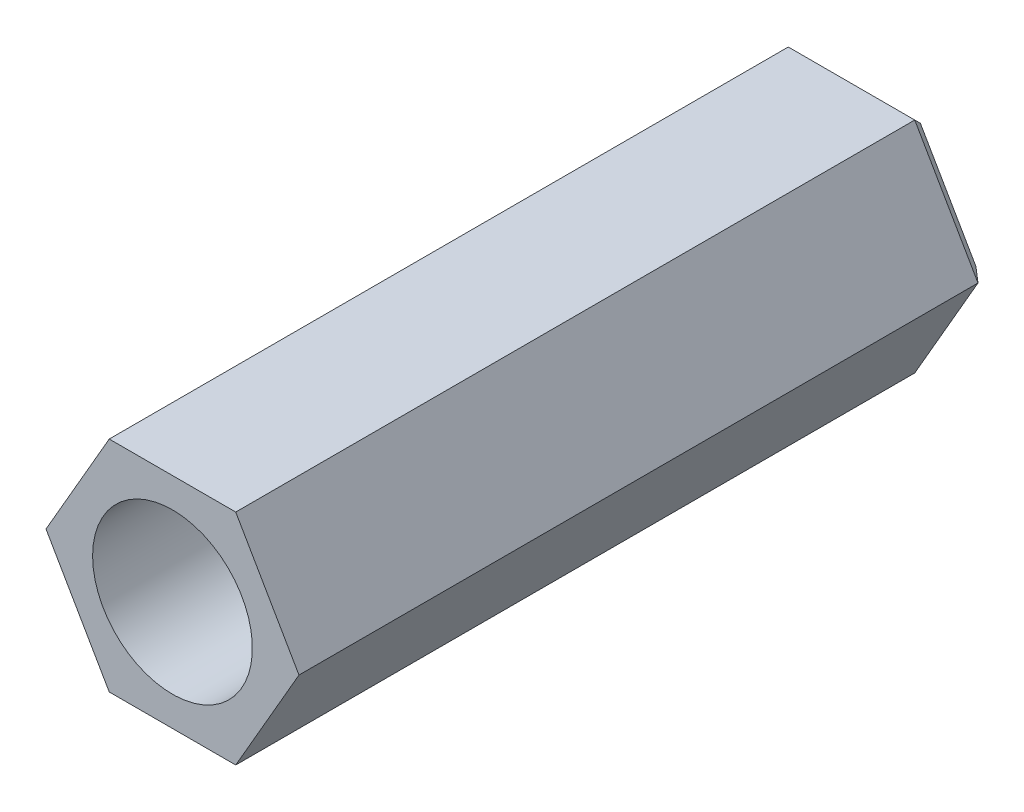
ISO-10303-21;
HEADER;
FILE_DESCRIPTION(('STEP AP214'),'2;1');
FILE_NAME('part.step','',(''),(''),'','','');
FILE_SCHEMA(('AUTOMOTIVE_DESIGN { 1 0 10303 214 1 1 1 1 }'));
ENDSEC;
DATA;
#1=APPLICATION_CONTEXT('core data for automotive mechanical design processes');
#2=APPLICATION_PROTOCOL_DEFINITION('international standard','automotive_design',2000,#1);
#3=PRODUCT_CONTEXT('',#1,'mechanical');
#4=PRODUCT('Part','Part','',(#3));
#5=PRODUCT_RELATED_PRODUCT_CATEGORY('part','',(#4));
#6=PRODUCT_DEFINITION_FORMATION('','',#4);
#7=PRODUCT_DEFINITION_CONTEXT('part definition',#1,'design');
#8=PRODUCT_DEFINITION('design','',#6,#7);
#9=PRODUCT_DEFINITION_SHAPE('','',#8);
#10=(LENGTH_UNIT() NAMED_UNIT(*) SI_UNIT(.MILLI.,.METRE.));
#11=(NAMED_UNIT(*) PLANE_ANGLE_UNIT() SI_UNIT($,.RADIAN.));
#12=(NAMED_UNIT(*) SI_UNIT($,.STERADIAN.) SOLID_ANGLE_UNIT());
#13=UNCERTAINTY_MEASURE_WITH_UNIT(LENGTH_MEASURE(1.E-05),#10,'distance_accuracy_value','');
#14=(GEOMETRIC_REPRESENTATION_CONTEXT(3) GLOBAL_UNCERTAINTY_ASSIGNED_CONTEXT((#13)) GLOBAL_UNIT_ASSIGNED_CONTEXT((#10,
#11,#12)) REPRESENTATION_CONTEXT('',''));
#15=CARTESIAN_POINT('',(0.,0.,0.));
#16=DIRECTION('',(0.,0.,1.));
#17=DIRECTION('',(1.,0.,0.));
#18=AXIS2_PLACEMENT_3D('',#15,#16,#17);
#19=CARTESIAN_POINT('',(0.,0.,13.));
#20=DIRECTION('',(0.,0.,1.));
#21=DIRECTION('',(1.,0.,0.));
#22=AXIS2_PLACEMENT_3D('',#19,#20,#21);
#23=PLANE('',#22);
#24=DIRECTION('',(0.5,-0.866025403784439,0.));
#25=VECTOR('',#24,1.);
#26=CARTESIAN_POINT('',(-2.375,0.,13.));
#27=LINE('',#26,#25);
#28=CARTESIAN_POINT('',(-2.375,0.,13.));
#29=VERTEX_POINT('',#28);
#30=CARTESIAN_POINT('',(-1.1875,-2.05681033398804,13.));
#31=VERTEX_POINT('',#30);
#32=EDGE_CURVE('E126',#29,#31,#27,.T.);
#33=ORIENTED_EDGE('',*,*,#32,.T.);
#34=DIRECTION('',(1.,0.,0.));
#35=VECTOR('',#34,1.);
#36=CARTESIAN_POINT('',(-1.1875,-2.05681033398804,13.));
#37=LINE('',#36,#35);
#38=CARTESIAN_POINT('',(1.1875,-2.05681033398804,13.));
#39=VERTEX_POINT('',#38);
#40=EDGE_CURVE('E115',#31,#39,#37,.T.);
#41=ORIENTED_EDGE('',*,*,#40,.T.);
#42=DIRECTION('',(0.5,0.866025403784439,0.));
#43=VECTOR('',#42,1.);
#44=CARTESIAN_POINT('',(1.1875,-2.05681033398804,13.));
#45=LINE('',#44,#43);
#46=CARTESIAN_POINT('',(2.375,0.,13.));
#47=VERTEX_POINT('',#46);
#48=EDGE_CURVE('E125',#39,#47,#45,.T.);
#49=ORIENTED_EDGE('',*,*,#48,.T.);
#50=DIRECTION('',(-0.5,0.866025403784439,0.));
#51=VECTOR('',#50,1.);
#52=CARTESIAN_POINT('',(2.375,0.,13.));
#53=LINE('',#52,#51);
#54=CARTESIAN_POINT('',(1.1875,2.05681033398804,13.));
#55=VERTEX_POINT('',#54);
#56=EDGE_CURVE('E214',#47,#55,#53,.T.);
#57=ORIENTED_EDGE('',*,*,#56,.T.);
#58=DIRECTION('',(-1.,0.,0.));
#59=VECTOR('',#58,1.);
#60=CARTESIAN_POINT('',(1.1875,2.05681033398804,13.));
#61=LINE('',#60,#59);
#62=CARTESIAN_POINT('',(-1.1875,2.05681033398804,13.));
#63=VERTEX_POINT('',#62);
#64=EDGE_CURVE('E217',#55,#63,#61,.T.);
#65=ORIENTED_EDGE('',*,*,#64,.T.);
#66=DIRECTION('',(-0.5,-0.866025403784439,0.));
#67=VECTOR('',#66,1.);
#68=CARTESIAN_POINT('',(-1.1875,2.05681033398804,13.));
#69=LINE('',#68,#67);
#70=EDGE_CURVE('E131',#63,#29,#69,.T.);
#71=ORIENTED_EDGE('',*,*,#70,.T.);
#72=EDGE_LOOP('',(#33,#41,#49,#57,#65,#71));
#73=FACE_BOUND('',#72,.T.);
#74=CARTESIAN_POINT('',(0.,0.,13.));
#75=DIRECTION('',(0.,0.,1.));
#76=DIRECTION('',(1.,0.,0.));
#77=AXIS2_PLACEMENT_3D('',#74,#75,#76);
#78=CIRCLE('',#77,1.5);
#79=CARTESIAN_POINT('',(-1.5,0.,13.));
#80=VERTEX_POINT('',#79);
#81=EDGE_CURVE('E133',#80,#80,#78,.T.);
#82=ORIENTED_EDGE('',*,*,#81,.F.);
#83=EDGE_LOOP('',(#82));
#84=FACE_BOUND('',#83,.T.);
#85=ADVANCED_FACE('F41',(#73,#84),#23,.T.);
#86=CARTESIAN_POINT('',(0.,0.,0.));
#87=DIRECTION('',(0.,0.,1.));
#88=DIRECTION('',(1.,0.,0.));
#89=AXIS2_PLACEMENT_3D('',#86,#87,#88);
#90=PLANE('',#89);
#91=DIRECTION('',(0.5,0.866025403784439,0.));
#92=VECTOR('',#91,1.);
#93=CARTESIAN_POINT('',(-1.56474364905389,0.90340516699402,0.));
#94=LINE('',#93,#92);
#95=CARTESIAN_POINT('',(-2.08632486540519,0.,0.));
#96=VERTEX_POINT('',#95);
#97=CARTESIAN_POINT('',(-1.04316243270259,1.80681033398804,0.));
#98=VERTEX_POINT('',#97);
#99=EDGE_CURVE('E150',#96,#98,#94,.T.);
#100=ORIENTED_EDGE('',*,*,#99,.T.);
#101=DIRECTION('',(1.,0.,0.));
#102=VECTOR('',#101,1.);
#103=CARTESIAN_POINT('',(0.,1.80681033398804,0.));
#104=LINE('',#103,#102);
#105=CARTESIAN_POINT('',(1.04316243270259,1.80681033398804,0.));
#106=VERTEX_POINT('',#105);
#107=EDGE_CURVE('E162',#98,#106,#104,.T.);
#108=ORIENTED_EDGE('',*,*,#107,.T.);
#109=DIRECTION('',(0.5,-0.866025403784439,0.));
#110=VECTOR('',#109,1.);
#111=CARTESIAN_POINT('',(1.56474364905389,0.90340516699402,0.));
#112=LINE('',#111,#110);
#113=CARTESIAN_POINT('',(2.08632486540519,0.,0.));
#114=VERTEX_POINT('',#113);
#115=EDGE_CURVE('E159',#106,#114,#112,.T.);
#116=ORIENTED_EDGE('',*,*,#115,.T.);
#117=DIRECTION('',(-0.5,-0.866025403784439,0.));
#118=VECTOR('',#117,1.);
#119=CARTESIAN_POINT('',(1.56474364905389,-0.90340516699402,0.));
#120=LINE('',#119,#118);
#121=CARTESIAN_POINT('',(1.04316243270259,-1.80681033398804,0.));
#122=VERTEX_POINT('',#121);
#123=EDGE_CURVE('E156',#114,#122,#120,.T.);
#124=ORIENTED_EDGE('',*,*,#123,.T.);
#125=DIRECTION('',(-1.,0.,0.));
#126=VECTOR('',#125,1.);
#127=CARTESIAN_POINT('',(0.,-1.80681033398804,0.));
#128=LINE('',#127,#126);
#129=CARTESIAN_POINT('',(-1.04316243270259,-1.80681033398804,0.));
#130=VERTEX_POINT('',#129);
#131=EDGE_CURVE('E153',#122,#130,#128,.T.);
#132=ORIENTED_EDGE('',*,*,#131,.T.);
#133=DIRECTION('',(-0.5,0.866025403784439,0.));
#134=VECTOR('',#133,1.);
#135=CARTESIAN_POINT('',(-1.56474364905389,-0.903405166994021,0.));
#136=LINE('',#135,#134);
#137=EDGE_CURVE('E142',#130,#96,#136,.T.);
#138=ORIENTED_EDGE('',*,*,#137,.T.);
#139=EDGE_LOOP('',(#100,#108,#116,#124,#132,#138));
#140=FACE_BOUND('',#139,.T.);
#141=CARTESIAN_POINT('',(0.,0.,0.));
#142=DIRECTION('',(0.,0.,1.));
#143=DIRECTION('',(1.,0.,0.));
#144=AXIS2_PLACEMENT_3D('',#141,#142,#143);
#145=CIRCLE('',#144,1.5);
#146=CARTESIAN_POINT('',(-1.5,0.,0.));
#147=VERTEX_POINT('',#146);
#148=EDGE_CURVE('E198',#147,#147,#145,.T.);
#149=ORIENTED_EDGE('',*,*,#148,.T.);
#150=EDGE_LOOP('',(#149));
#151=FACE_BOUND('',#150,.T.);
#152=ADVANCED_FACE('F262',(#140,#151),#90,.F.);
#153=CARTESIAN_POINT('',(-2.375,0.,13.));
#154=DIRECTION('',(0.866025403784439,0.5,0.));
#155=DIRECTION('',(-0.5,0.866025403784439,0.));
#156=AXIS2_PLACEMENT_3D('',#153,#154,#155);
#157=PLANE('',#156);
#158=DIRECTION('',(0.,0.,-1.));
#159=VECTOR('',#158,1.);
#160=CARTESIAN_POINT('',(-2.375,0.,13.));
#161=LINE('',#160,#159);
#162=CARTESIAN_POINT('',(-2.375,0.,0.250000000000004));
#163=VERTEX_POINT('',#162);
#164=EDGE_CURVE('E222',#29,#163,#161,.T.);
#165=ORIENTED_EDGE('',*,*,#164,.T.);
#166=DIRECTION('',(0.5,-0.866025403784439,0.));
#167=VECTOR('',#166,1.);
#168=CARTESIAN_POINT('',(-2.375,0.,0.25));
#169=LINE('',#168,#167);
#170=CARTESIAN_POINT('',(-1.1875,-2.05681033398804,0.250000000000004));
#171=VERTEX_POINT('',#170);
#172=EDGE_CURVE('E11',#163,#171,#169,.T.);
#173=ORIENTED_EDGE('',*,*,#172,.T.);
#174=DIRECTION('',(0.,0.,-1.));
#175=VECTOR('',#174,1.);
#176=CARTESIAN_POINT('',(-1.1875,-2.05681033398804,13.));
#177=LINE('',#176,#175);
#178=EDGE_CURVE('E118',#31,#171,#177,.T.);
#179=ORIENTED_EDGE('',*,*,#178,.F.);
#180=ORIENTED_EDGE('',*,*,#32,.F.);
#181=EDGE_LOOP('',(#165,#173,#179,#180));
#182=FACE_BOUND('',#181,.T.);
#183=ADVANCED_FACE('F135',(#182),#157,.F.);
#184=CARTESIAN_POINT('',(-1.1875,-2.05681033398804,13.));
#185=DIRECTION('',(0.,1.,0.));
#186=DIRECTION('',(0.,0.,1.));
#187=AXIS2_PLACEMENT_3D('',#184,#185,#186);
#188=PLANE('',#187);
#189=ORIENTED_EDGE('',*,*,#178,.T.);
#190=DIRECTION('',(1.,0.,0.));
#191=VECTOR('',#190,1.);
#192=CARTESIAN_POINT('',(-1.1875,-2.05681033398804,0.25));
#193=LINE('',#192,#191);
#194=CARTESIAN_POINT('',(1.1875,-2.05681033398804,0.250000000000004));
#195=VERTEX_POINT('',#194);
#196=EDGE_CURVE('E172',#171,#195,#193,.T.);
#197=ORIENTED_EDGE('',*,*,#196,.T.);
#198=DIRECTION('',(0.,0.,-1.));
#199=VECTOR('',#198,1.);
#200=CARTESIAN_POINT('',(1.1875,-2.05681033398804,13.));
#201=LINE('',#200,#199);
#202=EDGE_CURVE('E121',#39,#195,#201,.T.);
#203=ORIENTED_EDGE('',*,*,#202,.F.);
#204=ORIENTED_EDGE('',*,*,#40,.F.);
#205=EDGE_LOOP('',(#189,#197,#203,#204));
#206=FACE_BOUND('',#205,.T.);
#207=ADVANCED_FACE('F117',(#206),#188,.F.);
#208=CARTESIAN_POINT('',(1.1875,-2.05681033398804,13.));
#209=DIRECTION('',(-0.866025403784439,0.5,0.));
#210=DIRECTION('',(-0.5,-0.866025403784439,0.));
#211=AXIS2_PLACEMENT_3D('',#208,#209,#210);
#212=PLANE('',#211);
#213=ORIENTED_EDGE('',*,*,#202,.T.);
#214=DIRECTION('',(0.5,0.866025403784439,0.));
#215=VECTOR('',#214,1.);
#216=CARTESIAN_POINT('',(1.1875,-2.05681033398804,0.25));
#217=LINE('',#216,#215);
#218=CARTESIAN_POINT('',(2.375,0.,0.250000000000004));
#219=VERTEX_POINT('',#218);
#220=EDGE_CURVE('E169',#195,#219,#217,.T.);
#221=ORIENTED_EDGE('',*,*,#220,.T.);
#222=DIRECTION('',(0.,0.,-1.));
#223=VECTOR('',#222,1.);
#224=CARTESIAN_POINT('',(2.375,0.,13.));
#225=LINE('',#224,#223);
#226=EDGE_CURVE('E144',#47,#219,#225,.T.);
#227=ORIENTED_EDGE('',*,*,#226,.F.);
#228=ORIENTED_EDGE('',*,*,#48,.F.);
#229=EDGE_LOOP('',(#213,#221,#227,#228));
#230=FACE_BOUND('',#229,.T.);
#231=ADVANCED_FACE('F265',(#230),#212,.F.);
#232=CARTESIAN_POINT('',(2.375,0.,13.));
#233=DIRECTION('',(-0.866025403784439,-0.5,0.));
#234=DIRECTION('',(0.5,-0.866025403784439,0.));
#235=AXIS2_PLACEMENT_3D('',#232,#233,#234);
#236=PLANE('',#235);
#237=ORIENTED_EDGE('',*,*,#226,.T.);
#238=DIRECTION('',(-0.5,0.866025403784439,0.));
#239=VECTOR('',#238,1.);
#240=CARTESIAN_POINT('',(2.375,0.,0.25));
#241=LINE('',#240,#239);
#242=CARTESIAN_POINT('',(1.1875,2.05681033398804,0.250000000000004));
#243=VERTEX_POINT('',#242);
#244=EDGE_CURVE('E166',#219,#243,#241,.T.);
#245=ORIENTED_EDGE('',*,*,#244,.T.);
#246=DIRECTION('',(0.,0.,-1.));
#247=VECTOR('',#246,1.);
#248=CARTESIAN_POINT('',(1.1875,2.05681033398804,13.));
#249=LINE('',#248,#247);
#250=EDGE_CURVE('E228',#55,#243,#249,.T.);
#251=ORIENTED_EDGE('',*,*,#250,.F.);
#252=ORIENTED_EDGE('',*,*,#56,.F.);
#253=EDGE_LOOP('',(#237,#245,#251,#252));
#254=FACE_BOUND('',#253,.T.);
#255=ADVANCED_FACE('F237',(#254),#236,.F.);
#256=CARTESIAN_POINT('',(1.1875,2.05681033398804,13.));
#257=DIRECTION('',(0.,-1.,0.));
#258=DIRECTION('',(1.,0.,0.));
#259=AXIS2_PLACEMENT_3D('',#256,#257,#258);
#260=PLANE('',#259);
#261=ORIENTED_EDGE('',*,*,#250,.T.);
#262=DIRECTION('',(-1.,0.,0.));
#263=VECTOR('',#262,1.);
#264=CARTESIAN_POINT('',(1.1875,2.05681033398804,0.25));
#265=LINE('',#264,#263);
#266=CARTESIAN_POINT('',(-1.1875,2.05681033398804,0.250000000000004));
#267=VERTEX_POINT('',#266);
#268=EDGE_CURVE('E137',#243,#267,#265,.T.);
#269=ORIENTED_EDGE('',*,*,#268,.T.);
#270=DIRECTION('',(0.,0.,-1.));
#271=VECTOR('',#270,1.);
#272=CARTESIAN_POINT('',(-1.1875,2.05681033398804,13.));
#273=LINE('',#272,#271);
#274=EDGE_CURVE('E225',#63,#267,#273,.T.);
#275=ORIENTED_EDGE('',*,*,#274,.F.);
#276=ORIENTED_EDGE('',*,*,#64,.F.);
#277=EDGE_LOOP('',(#261,#269,#275,#276));
#278=FACE_BOUND('',#277,.T.);
#279=ADVANCED_FACE('F253',(#278),#260,.F.);
#280=CARTESIAN_POINT('',(-1.1875,2.05681033398804,13.));
#281=DIRECTION('',(0.866025403784439,-0.5,0.));
#282=DIRECTION('',(0.5,0.866025403784439,0.));
#283=AXIS2_PLACEMENT_3D('',#280,#281,#282);
#284=PLANE('',#283);
#285=ORIENTED_EDGE('',*,*,#274,.T.);
#286=DIRECTION('',(-0.5,-0.866025403784439,0.));
#287=VECTOR('',#286,1.);
#288=CARTESIAN_POINT('',(-1.1875,2.05681033398804,0.25));
#289=LINE('',#288,#287);
#290=EDGE_CURVE('E52',#267,#163,#289,.T.);
#291=ORIENTED_EDGE('',*,*,#290,.T.);
#292=ORIENTED_EDGE('',*,*,#164,.F.);
#293=ORIENTED_EDGE('',*,*,#70,.F.);
#294=EDGE_LOOP('',(#285,#291,#292,#293));
#295=FACE_BOUND('',#294,.T.);
#296=ADVANCED_FACE('F255',(#295),#284,.F.);
#297=CARTESIAN_POINT('',(0.,0.,13.));
#298=DIRECTION('',(0.,0.,-1.));
#299=DIRECTION('',(-1.,0.,0.));
#300=AXIS2_PLACEMENT_3D('',#297,#298,#299);
#301=CYLINDRICAL_SURFACE('',#300,1.5);
#302=CARTESIAN_POINT('',(-1.5,0.,13.));
#303=CARTESIAN_POINT('',(-1.5,0.,12.8645833333333));
#304=CARTESIAN_POINT('',(-1.5,0.,12.7291666666667));
#305=CARTESIAN_POINT('',(-1.5,0.,12.4583333333333));
#306=CARTESIAN_POINT('',(-1.5,0.,12.3229166666667));
#307=CARTESIAN_POINT('',(-1.5,0.,12.0520833333333));
#308=CARTESIAN_POINT('',(-1.5,0.,11.9166666666667));
#309=CARTESIAN_POINT('',(-1.5,0.,11.6458333333333));
#310=CARTESIAN_POINT('',(-1.5,0.,11.5104166666667));
#311=CARTESIAN_POINT('',(-1.5,0.,11.2395833333333));
#312=CARTESIAN_POINT('',(-1.5,0.,11.1041666666667));
#313=CARTESIAN_POINT('',(-1.5,0.,10.8333333333333));
#314=CARTESIAN_POINT('',(-1.5,0.,10.6979166666667));
#315=CARTESIAN_POINT('',(-1.5,0.,10.4270833333333));
#316=CARTESIAN_POINT('',(-1.5,0.,10.2916666666667));
#317=CARTESIAN_POINT('',(-1.5,0.,10.0208333333333));
#318=CARTESIAN_POINT('',(-1.5,0.,9.88541666666667));
#319=CARTESIAN_POINT('',(-1.5,0.,9.61458333333333));
#320=CARTESIAN_POINT('',(-1.5,0.,9.47916666666667));
#321=CARTESIAN_POINT('',(-1.5,0.,9.20833333333333));
#322=CARTESIAN_POINT('',(-1.5,0.,9.07291666666666));
#323=CARTESIAN_POINT('',(-1.5,0.,8.80208333333333));
#324=CARTESIAN_POINT('',(-1.5,0.,8.66666666666667));
#325=CARTESIAN_POINT('',(-1.5,0.,8.39583333333333));
#326=CARTESIAN_POINT('',(-1.5,0.,8.26041666666667));
#327=CARTESIAN_POINT('',(-1.5,0.,7.98958333333333));
#328=CARTESIAN_POINT('',(-1.5,0.,7.85416666666667));
#329=CARTESIAN_POINT('',(-1.5,0.,7.58333333333333));
#330=CARTESIAN_POINT('',(-1.5,0.,7.44791666666667));
#331=CARTESIAN_POINT('',(-1.5,0.,7.17708333333333));
#332=CARTESIAN_POINT('',(-1.5,0.,7.04166666666667));
#333=CARTESIAN_POINT('',(-1.5,0.,6.77083333333333));
#334=CARTESIAN_POINT('',(-1.5,0.,6.63541666666667));
#335=CARTESIAN_POINT('',(-1.5,0.,6.36458333333333));
#336=CARTESIAN_POINT('',(-1.5,0.,6.22916666666667));
#337=CARTESIAN_POINT('',(-1.5,0.,5.95833333333333));
#338=CARTESIAN_POINT('',(-1.5,0.,5.82291666666667));
#339=CARTESIAN_POINT('',(-1.5,0.,5.55208333333333));
#340=CARTESIAN_POINT('',(-1.5,0.,5.41666666666667));
#341=CARTESIAN_POINT('',(-1.5,0.,5.14583333333333));
#342=CARTESIAN_POINT('',(-1.5,0.,5.01041666666667));
#343=CARTESIAN_POINT('',(-1.5,0.,4.73958333333333));
#344=CARTESIAN_POINT('',(-1.5,0.,4.60416666666667));
#345=CARTESIAN_POINT('',(-1.5,0.,4.33333333333333));
#346=CARTESIAN_POINT('',(-1.5,0.,4.19791666666667));
#347=CARTESIAN_POINT('',(-1.5,0.,3.92708333333333));
#348=CARTESIAN_POINT('',(-1.5,0.,3.79166666666667));
#349=CARTESIAN_POINT('',(-1.5,0.,3.52083333333333));
#350=CARTESIAN_POINT('',(-1.5,0.,3.38541666666667));
#351=CARTESIAN_POINT('',(-1.5,0.,3.11458333333333));
#352=CARTESIAN_POINT('',(-1.5,0.,2.97916666666667));
#353=CARTESIAN_POINT('',(-1.5,0.,2.70833333333333));
#354=CARTESIAN_POINT('',(-1.5,0.,2.57291666666667));
#355=CARTESIAN_POINT('',(-1.5,0.,2.30208333333333));
#356=CARTESIAN_POINT('',(-1.5,0.,2.16666666666667));
#357=CARTESIAN_POINT('',(-1.5,0.,1.89583333333333));
#358=CARTESIAN_POINT('',(-1.5,0.,1.76041666666667));
#359=CARTESIAN_POINT('',(-1.5,0.,1.48958333333333));
#360=CARTESIAN_POINT('',(-1.5,0.,1.35416666666667));
#361=CARTESIAN_POINT('',(-1.5,0.,1.08333333333333));
#362=CARTESIAN_POINT('',(-1.5,0.,0.947916666666667));
#363=CARTESIAN_POINT('',(-1.5,0.,0.677083333333334));
#364=CARTESIAN_POINT('',(-1.5,0.,0.541666666666667));
#365=CARTESIAN_POINT('',(-1.5,0.,0.270833333333334));
#366=CARTESIAN_POINT('',(-1.5,0.,0.135416666666667));
#367=CARTESIAN_POINT('',(-1.5,0.,0.));
#368=B_SPLINE_CURVE_WITH_KNOTS('',3,(#302,#303,#304,#305,#306,#307,#308,#309,#310,#311,#312,
#313,#314,#315,#316,#317,#318,#319,#320,#321,#322,#323,#324,#325,#326,#327,#328,#329,#330,#331,
#332,#333,#334,#335,#336,#337,#338,#339,#340,#341,#342,#343,#344,#345,#346,#347,#348,#349,#350,
#351,#352,#353,#354,#355,#356,#357,#358,#359,#360,#361,#362,#363,#364,#365,#366,#367),
.UNSPECIFIED.,.F.,.F.,(4,2,2,2,2,2,2,2,2,2,2,2,2,2,2,2,2,2,2,2,2,2,2,2,2,2,2,2,2,2,2,2,4),(0.,
0.40625,0.812500000000001,1.21875,1.625,2.03125,2.4375,2.84375,3.25,3.65625,4.0625,4.46875,
4.875,5.28125,5.6875,6.09375,6.5,6.90625,7.3125,7.71875,8.125,8.53125,8.9375,9.34375,9.75,
10.15625,10.5625,10.96875,11.375,11.78125,12.1875,12.59375,13.),.UNSPECIFIED.);
#369=EDGE_CURVE('BSEAM281',#80,#147,#368,.T.);
#370=ORIENTED_EDGE('',*,*,#81,.T.);
#371=ORIENTED_EDGE('',*,*,#148,.F.);
#372=ORIENTED_EDGE('',*,*,#369,.T.);
#373=ORIENTED_EDGE('',*,*,#369,.F.);
#374=EDGE_LOOP('',(#370,#372,#371,#373));
#375=FACE_BOUND('',#374,.T.);
#376=ADVANCED_FACE('F281',(#375),#301,.F.);
#377=CARTESIAN_POINT('',(-1.1875,-2.05681033398804,0.25));
#378=DIRECTION('',(0.,0.707106781186546,0.707106781186549));
#379=DIRECTION('',(1.,0.,0.));
#380=AXIS2_PLACEMENT_3D('',#377,#378,#379);
#381=PLANE('',#380);
#382=DIRECTION('',(-0.377964473009228,-0.654653670707978,0.654653670707976));
#383=VECTOR('',#382,1.);
#384=CARTESIAN_POINT('',(-0.848214285714285,-1.46915023856289,-0.337660095425154));
#385=LINE('',#384,#383);
#386=EDGE_CURVE('E190',#130,#171,#385,.T.);
#387=ORIENTED_EDGE('',*,*,#386,.F.);
#388=ORIENTED_EDGE('',*,*,#131,.F.);
#389=DIRECTION('',(0.377964473009228,-0.654653670707978,0.654653670707976));
#390=VECTOR('',#389,1.);
#391=CARTESIAN_POINT('',(0.848214285714284,-1.46915023856288,-0.337660095425155));
#392=LINE('',#391,#390);
#393=EDGE_CURVE('E46',#195,#122,#392,.F.);
#394=ORIENTED_EDGE('',*,*,#393,.F.);
#395=ORIENTED_EDGE('',*,*,#196,.F.);
#396=EDGE_LOOP('',(#387,#388,#394,#395));
#397=FACE_BOUND('',#396,.T.);
#398=ADVANCED_FACE('F44',(#397),#381,.F.);
#399=CARTESIAN_POINT('',(1.1875,-2.05681033398804,0.25));
#400=DIRECTION('',(-0.612372435695793,0.353553390593273,0.707106781186549));
#401=DIRECTION('',(0.5,0.866025403784439,0.));
#402=AXIS2_PLACEMENT_3D('',#399,#400,#401);
#403=PLANE('',#402);
#404=ORIENTED_EDGE('',*,*,#393,.T.);
#405=ORIENTED_EDGE('',*,*,#123,.F.);
#406=DIRECTION('',(0.755928946018456,0.,0.654653670707976));
#407=VECTOR('',#406,1.);
#408=CARTESIAN_POINT('',(1.69642857142857,0.,-0.337660095425154));
#409=LINE('',#408,#407);
#410=EDGE_CURVE('E187',#219,#114,#409,.F.);
#411=ORIENTED_EDGE('',*,*,#410,.F.);
#412=ORIENTED_EDGE('',*,*,#220,.F.);
#413=EDGE_LOOP('',(#404,#405,#411,#412));
#414=FACE_BOUND('',#413,.T.);
#415=ADVANCED_FACE('F241',(#414),#403,.F.);
#416=CARTESIAN_POINT('',(-2.375,0.,0.25));
#417=DIRECTION('',(0.612372435695794,0.353553390593273,0.707106781186549));
#418=DIRECTION('',(0.5,-0.866025403784439,0.));
#419=AXIS2_PLACEMENT_3D('',#416,#417,#418);
#420=PLANE('',#419);
#421=ORIENTED_EDGE('',*,*,#386,.T.);
#422=ORIENTED_EDGE('',*,*,#172,.F.);
#423=DIRECTION('',(0.755928946018456,0.,-0.654653670707976));
#424=VECTOR('',#423,1.);
#425=CARTESIAN_POINT('',(-2.375,0.,0.25));
#426=LINE('',#425,#424);
#427=EDGE_CURVE('E183',#96,#163,#426,.F.);
#428=ORIENTED_EDGE('',*,*,#427,.F.);
#429=ORIENTED_EDGE('',*,*,#137,.F.);
#430=EDGE_LOOP('',(#421,#422,#428,#429));
#431=FACE_BOUND('',#430,.T.);
#432=ADVANCED_FACE('F257',(#431),#420,.F.);
#433=CARTESIAN_POINT('',(2.375,0.,0.25));
#434=DIRECTION('',(-0.612372435695793,-0.353553390593273,0.707106781186549));
#435=DIRECTION('',(-0.5,0.866025403784439,0.));
#436=AXIS2_PLACEMENT_3D('',#433,#434,#435);
#437=PLANE('',#436);
#438=ORIENTED_EDGE('',*,*,#410,.T.);
#439=ORIENTED_EDGE('',*,*,#115,.F.);
#440=DIRECTION('',(0.377964473009228,0.654653670707978,0.654653670707976));
#441=VECTOR('',#440,1.);
#442=CARTESIAN_POINT('',(0.848214285714285,1.46915023856289,-0.337660095425154));
#443=LINE('',#442,#441);
#444=EDGE_CURVE('E180',#243,#106,#443,.F.);
#445=ORIENTED_EDGE('',*,*,#444,.F.);
#446=ORIENTED_EDGE('',*,*,#244,.F.);
#447=EDGE_LOOP('',(#438,#439,#445,#446));
#448=FACE_BOUND('',#447,.T.);
#449=ADVANCED_FACE('F245',(#448),#437,.F.);
#450=CARTESIAN_POINT('',(-1.1875,2.05681033398804,0.25));
#451=DIRECTION('',(0.612372435695793,-0.353553390593273,0.707106781186549));
#452=DIRECTION('',(-0.5,-0.866025403784439,0.));
#453=AXIS2_PLACEMENT_3D('',#450,#451,#452);
#454=PLANE('',#453);
#455=ORIENTED_EDGE('',*,*,#427,.T.);
#456=ORIENTED_EDGE('',*,*,#290,.F.);
#457=DIRECTION('',(0.377964473009228,-0.654653670707978,-0.654653670707976));
#458=VECTOR('',#457,1.);
#459=CARTESIAN_POINT('',(-1.1875,2.05681033398804,0.25));
#460=LINE('',#459,#458);
#461=EDGE_CURVE('E177',#98,#267,#460,.F.);
#462=ORIENTED_EDGE('',*,*,#461,.F.);
#463=ORIENTED_EDGE('',*,*,#99,.F.);
#464=EDGE_LOOP('',(#455,#456,#462,#463));
#465=FACE_BOUND('',#464,.T.);
#466=ADVANCED_FACE('F260',(#465),#454,.F.);
#467=CARTESIAN_POINT('',(1.1875,2.05681033398804,0.25));
#468=DIRECTION('',(0.,-0.707106781186546,0.707106781186549));
#469=DIRECTION('',(-1.,0.,0.));
#470=AXIS2_PLACEMENT_3D('',#467,#468,#469);
#471=PLANE('',#470);
#472=ORIENTED_EDGE('',*,*,#444,.T.);
#473=ORIENTED_EDGE('',*,*,#107,.F.);
#474=ORIENTED_EDGE('',*,*,#461,.T.);
#475=ORIENTED_EDGE('',*,*,#268,.F.);
#476=EDGE_LOOP('',(#472,#473,#474,#475));
#477=FACE_BOUND('',#476,.T.);
#478=ADVANCED_FACE('F249',(#477),#471,.F.);
#479=CLOSED_SHELL('',(#85,#152,#183,#207,#231,#255,#279,#296,#376,#398,#415,#432,#449,#466,#478));
#480=MANIFOLD_SOLID_BREP('B2',#479);
#481=ADVANCED_BREP_SHAPE_REPRESENTATION('',(#18,#480),#14);
#482=SHAPE_DEFINITION_REPRESENTATION(#9,#481);
ENDSEC;
END-ISO-10303-21;
